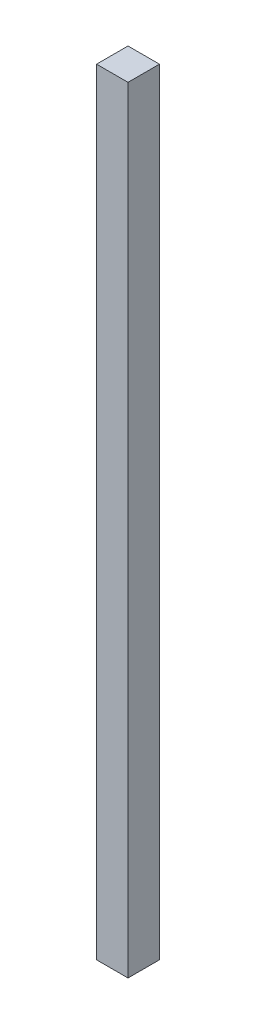
ISO-10303-21;
HEADER;
FILE_DESCRIPTION(('STEP AP214'),'2;1');
FILE_NAME('part.step','',(''),(''),'','','');
FILE_SCHEMA(('AUTOMOTIVE_DESIGN { 1 0 10303 214 1 1 1 1 }'));
ENDSEC;
DATA;
#1=APPLICATION_CONTEXT('core data for automotive mechanical design processes');
#2=APPLICATION_PROTOCOL_DEFINITION('international standard','automotive_design',2000,#1);
#3=PRODUCT_CONTEXT('',#1,'mechanical');
#4=PRODUCT('Part','Part','',(#3));
#5=PRODUCT_RELATED_PRODUCT_CATEGORY('part','',(#4));
#6=PRODUCT_DEFINITION_FORMATION('','',#4);
#7=PRODUCT_DEFINITION_CONTEXT('part definition',#1,'design');
#8=PRODUCT_DEFINITION('design','',#6,#7);
#9=PRODUCT_DEFINITION_SHAPE('','',#8);
#10=(LENGTH_UNIT() NAMED_UNIT(*) SI_UNIT(.MILLI.,.METRE.));
#11=(NAMED_UNIT(*) PLANE_ANGLE_UNIT() SI_UNIT($,.RADIAN.));
#12=(NAMED_UNIT(*) SI_UNIT($,.STERADIAN.) SOLID_ANGLE_UNIT());
#13=UNCERTAINTY_MEASURE_WITH_UNIT(LENGTH_MEASURE(1.E-05),#10,'distance_accuracy_value','');
#14=(GEOMETRIC_REPRESENTATION_CONTEXT(3) GLOBAL_UNCERTAINTY_ASSIGNED_CONTEXT((#13)) GLOBAL_UNIT_ASSIGNED_CONTEXT((#10,
#11,#12)) REPRESENTATION_CONTEXT('',''));
#15=CARTESIAN_POINT('',(0.,0.,0.));
#16=DIRECTION('',(0.,0.,1.));
#17=DIRECTION('',(1.,0.,0.));
#18=AXIS2_PLACEMENT_3D('',#15,#16,#17);
#19=CARTESIAN_POINT('',(0.,370.,0.));
#20=DIRECTION('',(-1.,0.,0.));
#21=DIRECTION('',(0.,0.,1.));
#22=AXIS2_PLACEMENT_3D('',#19,#20,#21);
#23=PLANE('',#22);
#24=DIRECTION('',(0.,0.,-1.));
#25=VECTOR('',#24,1.);
#26=CARTESIAN_POINT('',(0.,0.,0.));
#27=LINE('',#26,#25);
#28=CARTESIAN_POINT('',(0.,0.,0.));
#29=VERTEX_POINT('',#28);
#30=CARTESIAN_POINT('',(0.,0.,-15.));
#31=VERTEX_POINT('',#30);
#32=EDGE_CURVE('E106',#29,#31,#27,.T.);
#33=ORIENTED_EDGE('',*,*,#32,.F.);
#34=DIRECTION('',(0.,-1.,0.));
#35=VECTOR('',#34,1.);
#36=CARTESIAN_POINT('',(0.,370.,0.));
#37=LINE('',#36,#35);
#38=CARTESIAN_POINT('',(0.,370.,0.));
#39=VERTEX_POINT('',#38);
#40=EDGE_CURVE('E11',#39,#29,#37,.T.);
#41=ORIENTED_EDGE('',*,*,#40,.F.);
#42=DIRECTION('',(0.,0.,-1.));
#43=VECTOR('',#42,1.);
#44=CARTESIAN_POINT('',(0.,370.,0.));
#45=LINE('',#44,#43);
#46=CARTESIAN_POINT('',(0.,370.,-15.));
#47=VERTEX_POINT('',#46);
#48=EDGE_CURVE('E101',#39,#47,#45,.T.);
#49=ORIENTED_EDGE('',*,*,#48,.T.);
#50=DIRECTION('',(0.,-1.,0.));
#51=VECTOR('',#50,1.);
#52=CARTESIAN_POINT('',(0.,370.,-15.));
#53=LINE('',#52,#51);
#54=EDGE_CURVE('E44',#47,#31,#53,.T.);
#55=ORIENTED_EDGE('',*,*,#54,.T.);
#56=EDGE_LOOP('',(#33,#41,#49,#55));
#57=FACE_BOUND('',#56,.T.);
#58=ADVANCED_FACE('F41',(#57),#23,.T.);
#59=CARTESIAN_POINT('',(0.,370.,0.));
#60=DIRECTION('',(0.,0.,-1.));
#61=DIRECTION('',(-1.,0.,0.));
#62=AXIS2_PLACEMENT_3D('',#59,#60,#61);
#63=PLANE('',#62);
#64=DIRECTION('',(1.,0.,0.));
#65=VECTOR('',#64,1.);
#66=CARTESIAN_POINT('',(0.,0.,0.));
#67=LINE('',#66,#65);
#68=CARTESIAN_POINT('',(15.,0.,0.));
#69=VERTEX_POINT('',#68);
#70=EDGE_CURVE('E74',#29,#69,#67,.T.);
#71=ORIENTED_EDGE('',*,*,#70,.T.);
#72=DIRECTION('',(0.,-1.,0.));
#73=VECTOR('',#72,1.);
#74=CARTESIAN_POINT('',(15.,370.,0.));
#75=LINE('',#74,#73);
#76=CARTESIAN_POINT('',(15.,370.,0.));
#77=VERTEX_POINT('',#76);
#78=EDGE_CURVE('E50',#77,#69,#75,.T.);
#79=ORIENTED_EDGE('',*,*,#78,.F.);
#80=DIRECTION('',(1.,0.,0.));
#81=VECTOR('',#80,1.);
#82=CARTESIAN_POINT('',(0.,370.,0.));
#83=LINE('',#82,#81);
#84=EDGE_CURVE('E91',#39,#77,#83,.T.);
#85=ORIENTED_EDGE('',*,*,#84,.F.);
#86=ORIENTED_EDGE('',*,*,#40,.T.);
#87=EDGE_LOOP('',(#71,#79,#85,#86));
#88=FACE_BOUND('',#87,.T.);
#89=ADVANCED_FACE('F116',(#88),#63,.F.);
#90=CARTESIAN_POINT('',(15.,370.,0.));
#91=DIRECTION('',(-1.,0.,0.));
#92=DIRECTION('',(0.,0.,1.));
#93=AXIS2_PLACEMENT_3D('',#90,#91,#92);
#94=PLANE('',#93);
#95=DIRECTION('',(0.,0.,-1.));
#96=VECTOR('',#95,1.);
#97=CARTESIAN_POINT('',(15.,0.,0.));
#98=LINE('',#97,#96);
#99=CARTESIAN_POINT('',(15.,0.,-15.));
#100=VERTEX_POINT('',#99);
#101=EDGE_CURVE('E98',#69,#100,#98,.T.);
#102=ORIENTED_EDGE('',*,*,#101,.T.);
#103=DIRECTION('',(0.,-1.,0.));
#104=VECTOR('',#103,1.);
#105=CARTESIAN_POINT('',(15.,370.,-15.));
#106=LINE('',#105,#104);
#107=CARTESIAN_POINT('',(15.,370.,-15.));
#108=VERTEX_POINT('',#107);
#109=EDGE_CURVE('E95',#108,#100,#106,.T.);
#110=ORIENTED_EDGE('',*,*,#109,.F.);
#111=DIRECTION('',(0.,0.,-1.));
#112=VECTOR('',#111,1.);
#113=CARTESIAN_POINT('',(15.,370.,0.));
#114=LINE('',#113,#112);
#115=EDGE_CURVE('E86',#77,#108,#114,.T.);
#116=ORIENTED_EDGE('',*,*,#115,.F.);
#117=ORIENTED_EDGE('',*,*,#78,.T.);
#118=EDGE_LOOP('',(#102,#110,#116,#117));
#119=FACE_BOUND('',#118,.T.);
#120=ADVANCED_FACE('F96',(#119),#94,.F.);
#121=CARTESIAN_POINT('',(0.,370.,-15.));
#122=DIRECTION('',(0.,0.,-1.));
#123=DIRECTION('',(-1.,0.,0.));
#124=AXIS2_PLACEMENT_3D('',#121,#122,#123);
#125=PLANE('',#124);
#126=DIRECTION('',(1.,0.,0.));
#127=VECTOR('',#126,1.);
#128=CARTESIAN_POINT('',(0.,0.,-15.));
#129=LINE('',#128,#127);
#130=EDGE_CURVE('E109',#31,#100,#129,.T.);
#131=ORIENTED_EDGE('',*,*,#130,.F.);
#132=ORIENTED_EDGE('',*,*,#54,.F.);
#133=DIRECTION('',(1.,0.,0.));
#134=VECTOR('',#133,1.);
#135=CARTESIAN_POINT('',(0.,370.,-15.));
#136=LINE('',#135,#134);
#137=EDGE_CURVE('E90',#47,#108,#136,.T.);
#138=ORIENTED_EDGE('',*,*,#137,.T.);
#139=ORIENTED_EDGE('',*,*,#109,.T.);
#140=EDGE_LOOP('',(#131,#132,#138,#139));
#141=FACE_BOUND('',#140,.T.);
#142=ADVANCED_FACE('F100',(#141),#125,.T.);
#143=CARTESIAN_POINT('',(0.,370.,0.));
#144=DIRECTION('',(0.,-1.,0.));
#145=DIRECTION('',(0.,0.,-1.));
#146=AXIS2_PLACEMENT_3D('',#143,#144,#145);
#147=PLANE('',#146);
#148=ORIENTED_EDGE('',*,*,#48,.F.);
#149=ORIENTED_EDGE('',*,*,#84,.T.);
#150=ORIENTED_EDGE('',*,*,#115,.T.);
#151=ORIENTED_EDGE('',*,*,#137,.F.);
#152=EDGE_LOOP('',(#148,#149,#150,#151));
#153=FACE_BOUND('',#152,.T.);
#154=ADVANCED_FACE('F89',(#153),#147,.F.);
#155=CARTESIAN_POINT('',(0.,0.,0.));
#156=DIRECTION('',(0.,-1.,0.));
#157=DIRECTION('',(0.,0.,-1.));
#158=AXIS2_PLACEMENT_3D('',#155,#156,#157);
#159=PLANE('',#158);
#160=ORIENTED_EDGE('',*,*,#32,.T.);
#161=ORIENTED_EDGE('',*,*,#130,.T.);
#162=ORIENTED_EDGE('',*,*,#101,.F.);
#163=ORIENTED_EDGE('',*,*,#70,.F.);
#164=EDGE_LOOP('',(#160,#161,#162,#163));
#165=FACE_BOUND('',#164,.T.);
#166=ADVANCED_FACE('F114',(#165),#159,.T.);
#167=CLOSED_SHELL('',(#58,#89,#120,#142,#154,#166));
#168=MANIFOLD_SOLID_BREP('B2',#167);
#169=ADVANCED_BREP_SHAPE_REPRESENTATION('',(#18,#168),#14);
#170=SHAPE_DEFINITION_REPRESENTATION(#9,#169);
ENDSEC;
END-ISO-10303-21;
